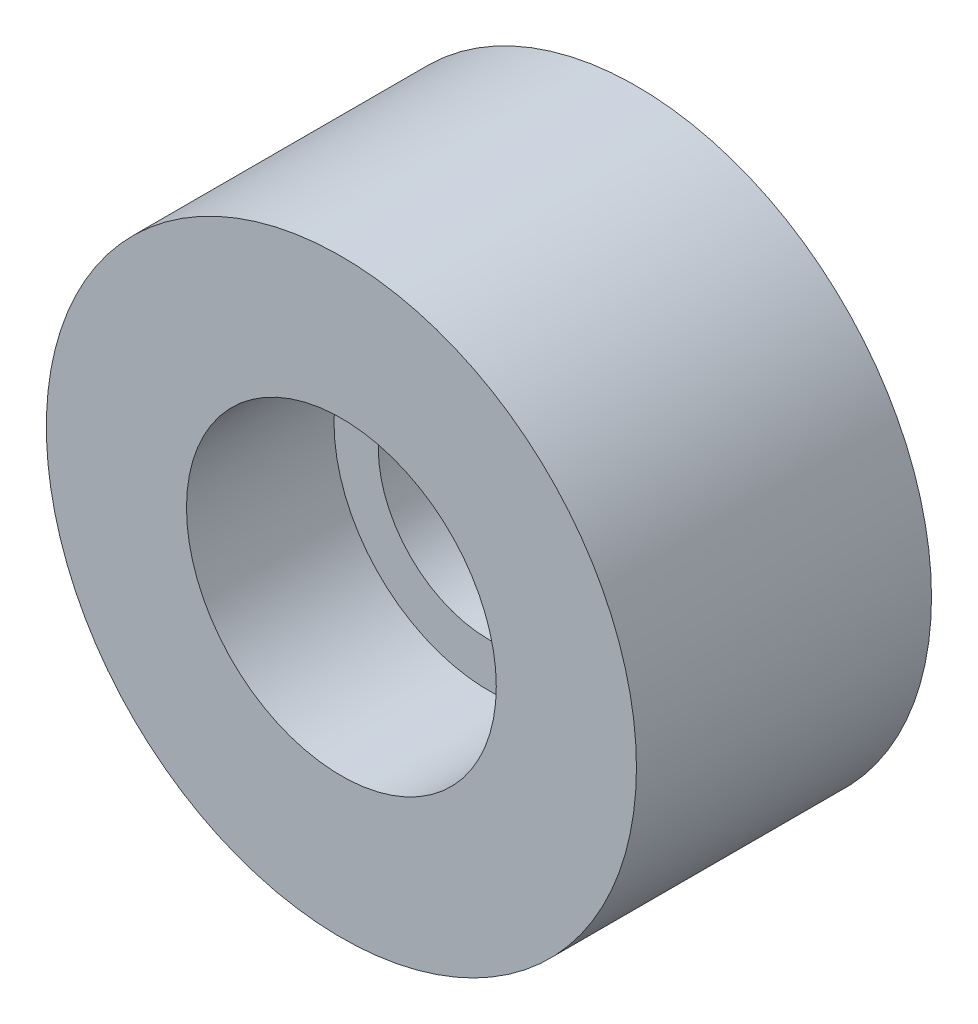
ISO-10303-21;
HEADER;
FILE_DESCRIPTION(('STEP AP214'),'2;1');
FILE_NAME('part.step','',(''),(''),'','','');
FILE_SCHEMA(('AUTOMOTIVE_DESIGN { 1 0 10303 214 1 1 1 1 }'));
ENDSEC;
DATA;
#1=APPLICATION_CONTEXT('core data for automotive mechanical design processes');
#2=APPLICATION_PROTOCOL_DEFINITION('international standard','automotive_design',2000,#1);
#3=PRODUCT_CONTEXT('',#1,'mechanical');
#4=PRODUCT('Part','Part','',(#3));
#5=PRODUCT_RELATED_PRODUCT_CATEGORY('part','',(#4));
#6=PRODUCT_DEFINITION_FORMATION('','',#4);
#7=PRODUCT_DEFINITION_CONTEXT('part definition',#1,'design');
#8=PRODUCT_DEFINITION('design','',#6,#7);
#9=PRODUCT_DEFINITION_SHAPE('','',#8);
#10=(LENGTH_UNIT() NAMED_UNIT(*) SI_UNIT(.MILLI.,.METRE.));
#11=(NAMED_UNIT(*) PLANE_ANGLE_UNIT() SI_UNIT($,.RADIAN.));
#12=(NAMED_UNIT(*) SI_UNIT($,.STERADIAN.) SOLID_ANGLE_UNIT());
#13=UNCERTAINTY_MEASURE_WITH_UNIT(LENGTH_MEASURE(1.E-05),#10,'distance_accuracy_value','');
#14=(GEOMETRIC_REPRESENTATION_CONTEXT(3) GLOBAL_UNCERTAINTY_ASSIGNED_CONTEXT((#13)) GLOBAL_UNIT_ASSIGNED_CONTEXT((#10,
#11,#12)) REPRESENTATION_CONTEXT('',''));
#15=CARTESIAN_POINT('',(0.,0.,0.));
#16=DIRECTION('',(0.,0.,1.));
#17=DIRECTION('',(1.,0.,0.));
#18=AXIS2_PLACEMENT_3D('',#15,#16,#17);
#19=CARTESIAN_POINT('',(0.,0.,4.));
#20=DIRECTION('',(0.,0.,-1.));
#21=DIRECTION('',(-1.,0.,0.));
#22=AXIS2_PLACEMENT_3D('',#19,#20,#21);
#23=CYLINDRICAL_SURFACE('',#22,4.);
#24=CARTESIAN_POINT('',(0.,0.,4.));
#25=DIRECTION('',(0.,0.,1.));
#26=DIRECTION('',(1.,0.,0.));
#27=AXIS2_PLACEMENT_3D('',#24,#25,#26);
#28=CIRCLE('',#27,4.);
#29=CARTESIAN_POINT('',(4.,0.,4.));
#30=VERTEX_POINT('',#29);
#31=EDGE_CURVE('E10',#30,#30,#28,.T.);
#32=ORIENTED_EDGE('',*,*,#31,.F.);
#33=EDGE_LOOP('',(#32));
#34=FACE_BOUND('',#33,.T.);
#35=CARTESIAN_POINT('',(0.,0.,0.));
#36=DIRECTION('',(0.,0.,1.));
#37=DIRECTION('',(1.,0.,0.));
#38=AXIS2_PLACEMENT_3D('',#35,#36,#37);
#39=CIRCLE('',#38,4.);
#40=CARTESIAN_POINT('',(4.,0.,0.));
#41=VERTEX_POINT('',#40);
#42=EDGE_CURVE('E38',#41,#41,#39,.T.);
#43=ORIENTED_EDGE('',*,*,#42,.T.);
#44=EDGE_LOOP('',(#43));
#45=FACE_BOUND('',#44,.T.);
#46=ADVANCED_FACE('F31',(#34,#45),#23,.T.);
#47=CARTESIAN_POINT('',(0.,0.,4.));
#48=DIRECTION('',(0.,0.,1.));
#49=DIRECTION('',(1.,0.,0.));
#50=AXIS2_PLACEMENT_3D('',#47,#48,#49);
#51=PLANE('',#50);
#52=CARTESIAN_POINT('',(0.,0.,4.));
#53=DIRECTION('',(0.,0.,1.));
#54=DIRECTION('',(1.,0.,0.));
#55=AXIS2_PLACEMENT_3D('',#52,#53,#54);
#56=CIRCLE('',#55,2.1);
#57=CARTESIAN_POINT('',(2.1,0.,4.));
#58=VERTEX_POINT('',#57);
#59=EDGE_CURVE('E45',#58,#58,#56,.T.);
#60=ORIENTED_EDGE('',*,*,#59,.F.);
#61=EDGE_LOOP('',(#60));
#62=FACE_BOUND('',#61,.T.);
#63=ORIENTED_EDGE('',*,*,#31,.T.);
#64=EDGE_LOOP('',(#63));
#65=FACE_BOUND('',#64,.T.);
#66=ADVANCED_FACE('F72',(#62,#65),#51,.T.);
#67=CARTESIAN_POINT('',(0.,0.,0.));
#68=DIRECTION('',(0.,0.,1.));
#69=DIRECTION('',(1.,0.,0.));
#70=AXIS2_PLACEMENT_3D('',#67,#68,#69);
#71=PLANE('',#70);
#72=CARTESIAN_POINT('',(0.,0.,0.));
#73=DIRECTION('',(0.,0.,-1.));
#74=DIRECTION('',(-1.,0.,0.));
#75=AXIS2_PLACEMENT_3D('',#72,#73,#74);
#76=CIRCLE('',#75,1.5);
#77=CARTESIAN_POINT('',(-1.5,0.,0.));
#78=VERTEX_POINT('',#77);
#79=EDGE_CURVE('E50',#78,#78,#76,.T.);
#80=ORIENTED_EDGE('',*,*,#79,.F.);
#81=EDGE_LOOP('',(#80));
#82=FACE_BOUND('',#81,.T.);
#83=ORIENTED_EDGE('',*,*,#42,.F.);
#84=EDGE_LOOP('',(#83));
#85=FACE_BOUND('',#84,.T.);
#86=ADVANCED_FACE('F68',(#82,#85),#71,.F.);
#87=CARTESIAN_POINT('',(0.,0.,2.));
#88=DIRECTION('',(0.,0.,1.));
#89=DIRECTION('',(1.,0.,0.));
#90=AXIS2_PLACEMENT_3D('',#87,#88,#89);
#91=CYLINDRICAL_SURFACE('',#90,2.1);
#92=CARTESIAN_POINT('',(0.,0.,2.));
#93=DIRECTION('',(0.,0.,1.));
#94=DIRECTION('',(1.,0.,0.));
#95=AXIS2_PLACEMENT_3D('',#92,#93,#94);
#96=CIRCLE('',#95,2.1);
#97=CARTESIAN_POINT('',(2.1,0.,2.));
#98=VERTEX_POINT('',#97);
#99=EDGE_CURVE('E43',#98,#98,#96,.T.);
#100=ORIENTED_EDGE('',*,*,#99,.F.);
#101=EDGE_LOOP('',(#100));
#102=FACE_BOUND('',#101,.T.);
#103=ORIENTED_EDGE('',*,*,#59,.T.);
#104=EDGE_LOOP('',(#103));
#105=FACE_BOUND('',#104,.T.);
#106=ADVANCED_FACE('F62',(#102,#105),#91,.F.);
#107=CARTESIAN_POINT('',(0.,0.,2.));
#108=DIRECTION('',(0.,0.,1.));
#109=DIRECTION('',(1.,0.,0.));
#110=AXIS2_PLACEMENT_3D('',#107,#108,#109);
#111=PLANE('',#110);
#112=CARTESIAN_POINT('',(0.,0.,2.));
#113=DIRECTION('',(0.,0.,1.));
#114=DIRECTION('',(1.,0.,0.));
#115=AXIS2_PLACEMENT_3D('',#112,#113,#114);
#116=CIRCLE('',#115,1.5);
#117=CARTESIAN_POINT('',(1.5,0.,2.));
#118=VERTEX_POINT('',#117);
#119=EDGE_CURVE('E34',#118,#118,#116,.T.);
#120=ORIENTED_EDGE('',*,*,#119,.F.);
#121=EDGE_LOOP('',(#120));
#122=FACE_BOUND('',#121,.T.);
#123=ORIENTED_EDGE('',*,*,#99,.T.);
#124=EDGE_LOOP('',(#123));
#125=FACE_BOUND('',#124,.T.);
#126=ADVANCED_FACE('F59',(#122,#125),#111,.T.);
#127=CARTESIAN_POINT('',(0.,0.,4.));
#128=DIRECTION('',(0.,0.,-1.));
#129=DIRECTION('',(-1.,0.,0.));
#130=AXIS2_PLACEMENT_3D('',#127,#128,#129);
#131=CYLINDRICAL_SURFACE('',#130,1.5);
#132=ORIENTED_EDGE('',*,*,#119,.T.);
#133=EDGE_LOOP('',(#132));
#134=FACE_BOUND('',#133,.T.);
#135=ORIENTED_EDGE('',*,*,#79,.T.);
#136=EDGE_LOOP('',(#135));
#137=FACE_BOUND('',#136,.T.);
#138=ADVANCED_FACE('F57',(#134,#137),#131,.F.);
#139=CLOSED_SHELL('',(#46,#66,#86,#106,#126,#138));
#140=MANIFOLD_SOLID_BREP('B2',#139);
#141=ADVANCED_BREP_SHAPE_REPRESENTATION('',(#18,#140),#14);
#142=SHAPE_DEFINITION_REPRESENTATION(#9,#141);
ENDSEC;
END-ISO-10303-21;
